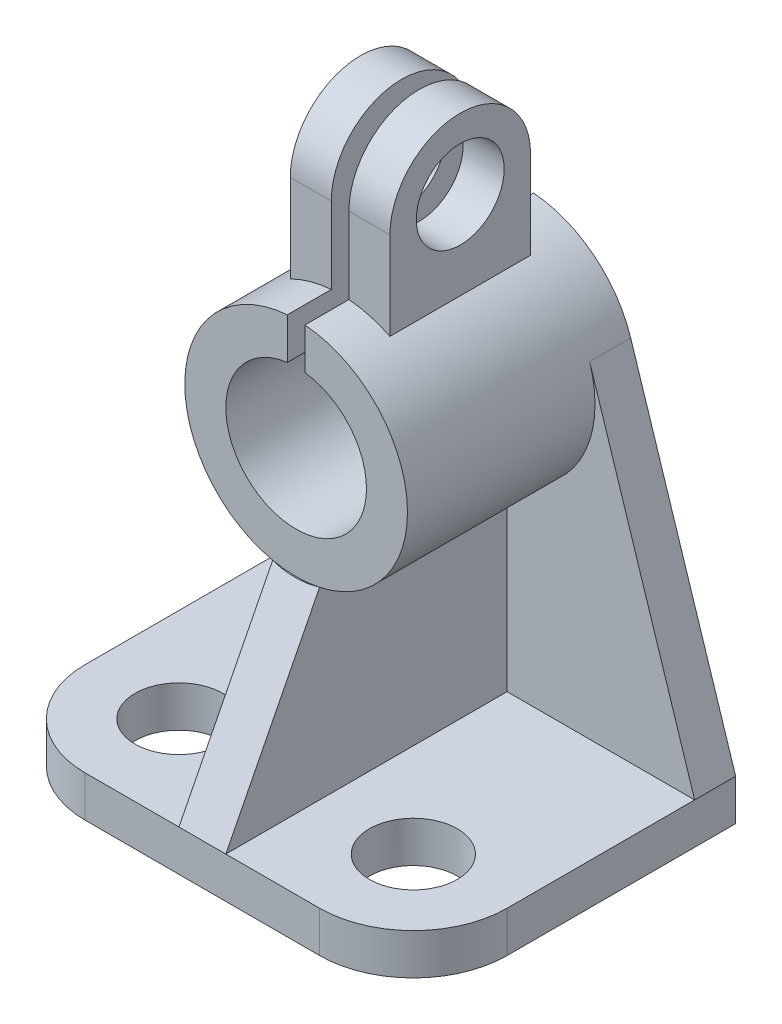
ISO-10303-21;
HEADER;
FILE_DESCRIPTION(('STEP AP214'),'2;1');
FILE_NAME('part.step','',(''),(''),'','','');
FILE_SCHEMA(('AUTOMOTIVE_DESIGN { 1 0 10303 214 1 1 1 1 }'));
ENDSEC;
DATA;
#1=APPLICATION_CONTEXT('core data for automotive mechanical design processes');
#2=APPLICATION_PROTOCOL_DEFINITION('international standard','automotive_design',2000,#1);
#3=PRODUCT_CONTEXT('',#1,'mechanical');
#4=PRODUCT('Part','Part','',(#3));
#5=PRODUCT_RELATED_PRODUCT_CATEGORY('part','',(#4));
#6=PRODUCT_DEFINITION_FORMATION('','',#4);
#7=PRODUCT_DEFINITION_CONTEXT('part definition',#1,'design');
#8=PRODUCT_DEFINITION('design','',#6,#7);
#9=PRODUCT_DEFINITION_SHAPE('','',#8);
#10=(LENGTH_UNIT() NAMED_UNIT(*) SI_UNIT(.MILLI.,.METRE.));
#11=(NAMED_UNIT(*) PLANE_ANGLE_UNIT() SI_UNIT($,.RADIAN.));
#12=(NAMED_UNIT(*) SI_UNIT($,.STERADIAN.) SOLID_ANGLE_UNIT());
#13=UNCERTAINTY_MEASURE_WITH_UNIT(LENGTH_MEASURE(1.E-05),#10,'distance_accuracy_value','');
#14=(GEOMETRIC_REPRESENTATION_CONTEXT(3) GLOBAL_UNCERTAINTY_ASSIGNED_CONTEXT((#13)) GLOBAL_UNIT_ASSIGNED_CONTEXT((#10,
#11,#12)) REPRESENTATION_CONTEXT('',''));
#15=CARTESIAN_POINT('',(0.,0.,0.));
#16=DIRECTION('',(0.,0.,1.));
#17=DIRECTION('',(1.,0.,0.));
#18=AXIS2_PLACEMENT_3D('',#15,#16,#17);
#19=CARTESIAN_POINT('',(8.49999999999999,0.,31.5));
#20=DIRECTION('',(-1.,0.,0.));
#21=DIRECTION('',(0.,-1.,0.));
#22=AXIS2_PLACEMENT_3D('',#19,#20,#21);
#23=PLANE('',#22);
#24=DIRECTION('',(0.,1.,0.));
#25=VECTOR('',#24,1.);
#26=CARTESIAN_POINT('',(8.49999999999999,0.,7.5));
#27=LINE('',#26,#25);
#28=CARTESIAN_POINT('',(8.5,73.9926454679664,7.5));
#29=VERTEX_POINT('',#28);
#30=CARTESIAN_POINT('',(8.5,88.9999999999999,7.5));
#31=VERTEX_POINT('',#30);
#32=EDGE_CURVE('E309',#29,#31,#27,.T.);
#33=ORIENTED_EDGE('',*,*,#32,.T.);
#34=CARTESIAN_POINT('',(8.5,88.9999999999999,19.5));
#35=DIRECTION('',(-1.,0.,0.));
#36=DIRECTION('',(0.,-1.,0.));
#37=AXIS2_PLACEMENT_3D('',#34,#35,#36);
#38=CIRCLE('',#37,12.);
#39=CARTESIAN_POINT('',(8.5,88.9999999999999,31.5));
#40=VERTEX_POINT('',#39);
#41=EDGE_CURVE('E452',#31,#40,#38,.F.);
#42=ORIENTED_EDGE('',*,*,#41,.T.);
#43=DIRECTION('',(0.,1.,0.));
#44=VECTOR('',#43,1.);
#45=CARTESIAN_POINT('',(8.49999999999999,0.,31.5));
#46=LINE('',#45,#44);
#47=CARTESIAN_POINT('',(8.5,73.9926454679664,31.5));
#48=VERTEX_POINT('',#47);
#49=EDGE_CURVE('E296',#48,#40,#46,.T.);
#50=ORIENTED_EDGE('',*,*,#49,.F.);
#51=DIRECTION('',(0.,0.,-1.));
#52=VECTOR('',#51,1.);
#53=CARTESIAN_POINT('',(8.5,73.9926454679664,31.5));
#54=LINE('',#53,#52);
#55=EDGE_CURVE('E305',#48,#29,#54,.T.);
#56=ORIENTED_EDGE('',*,*,#55,.T.);
#57=EDGE_LOOP('',(#33,#42,#50,#56));
#58=FACE_BOUND('',#57,.T.);
#59=CARTESIAN_POINT('',(8.5,88.9999999999999,19.5));
#60=DIRECTION('',(1.,0.,0.));
#61=DIRECTION('',(0.,0.,-1.));
#62=AXIS2_PLACEMENT_3D('',#59,#60,#61);
#63=CIRCLE('',#62,7.49999999999999);
#64=CARTESIAN_POINT('',(8.5,88.9999999999999,12.));
#65=VERTEX_POINT('',#64);
#66=EDGE_CURVE('E480',#65,#65,#63,.T.);
#67=ORIENTED_EDGE('',*,*,#66,.F.);
#68=EDGE_LOOP('',(#67));
#69=FACE_BOUND('',#68,.T.);
#70=ADVANCED_FACE('F45',(#58,#69),#23,.F.);
#71=CARTESIAN_POINT('',(-1.5,88.9999999999999,19.5));
#72=DIRECTION('',(-1.,0.,0.));
#73=DIRECTION('',(0.,0.,1.));
#74=AXIS2_PLACEMENT_3D('',#71,#72,#73);
#75=CYLINDRICAL_SURFACE('',#74,12.);
#76=DIRECTION('',(1.,0.,0.));
#77=VECTOR('',#76,1.);
#78=CARTESIAN_POINT('',(-1.5,88.9999999999999,31.5));
#79=LINE('',#78,#77);
#80=CARTESIAN_POINT('',(-1.5,88.9999999999999,31.5));
#81=VERTEX_POINT('',#80);
#82=CARTESIAN_POINT('',(-8.5,88.9999999999999,31.5));
#83=VERTEX_POINT('',#82);
#84=EDGE_CURVE('E458',#81,#83,#79,.F.);
#85=ORIENTED_EDGE('',*,*,#84,.F.);
#86=CARTESIAN_POINT('',(-1.5,88.9999999999999,19.5));
#87=DIRECTION('',(-1.,0.,0.));
#88=DIRECTION('',(0.,0.,1.));
#89=AXIS2_PLACEMENT_3D('',#86,#87,#88);
#90=CIRCLE('',#89,12.);
#91=CARTESIAN_POINT('',(-1.5,88.9999999999999,7.5));
#92=VERTEX_POINT('',#91);
#93=EDGE_CURVE('E466',#92,#81,#90,.F.);
#94=ORIENTED_EDGE('',*,*,#93,.F.);
#95=DIRECTION('',(-1.,0.,0.));
#96=VECTOR('',#95,1.);
#97=CARTESIAN_POINT('',(0.,88.9999999999999,7.5));
#98=LINE('',#97,#96);
#99=CARTESIAN_POINT('',(-8.5,88.9999999999999,7.5));
#100=VERTEX_POINT('',#99);
#101=EDGE_CURVE('E462',#100,#92,#98,.F.);
#102=ORIENTED_EDGE('',*,*,#101,.F.);
#103=CARTESIAN_POINT('',(-8.5,88.9999999999999,19.5));
#104=DIRECTION('',(-1.,0.,0.));
#105=DIRECTION('',(0.,-1.,0.));
#106=AXIS2_PLACEMENT_3D('',#103,#104,#105);
#107=CIRCLE('',#106,12.);
#108=EDGE_CURVE('E469',#83,#100,#107,.T.);
#109=ORIENTED_EDGE('',*,*,#108,.F.);
#110=EDGE_LOOP('',(#85,#94,#102,#109));
#111=FACE_BOUND('',#110,.T.);
#112=ADVANCED_FACE('F545',(#111),#75,.T.);
#113=CARTESIAN_POINT('',(8.5,88.9999999999999,19.5));
#114=DIRECTION('',(1.,0.,0.));
#115=DIRECTION('',(0.,0.,-1.));
#116=AXIS2_PLACEMENT_3D('',#113,#114,#115);
#117=CYLINDRICAL_SURFACE('',#116,12.);
#118=DIRECTION('',(1.,0.,0.));
#119=VECTOR('',#118,1.);
#120=CARTESIAN_POINT('',(0.,88.9999999999999,31.5));
#121=LINE('',#120,#119);
#122=CARTESIAN_POINT('',(1.5,88.9999999999999,31.5));
#123=VERTEX_POINT('',#122);
#124=EDGE_CURVE('E444',#40,#123,#121,.F.);
#125=ORIENTED_EDGE('',*,*,#124,.F.);
#126=ORIENTED_EDGE('',*,*,#41,.F.);
#127=DIRECTION('',(-1.,0.,0.));
#128=VECTOR('',#127,1.);
#129=CARTESIAN_POINT('',(8.5,88.9999999999999,7.5));
#130=LINE('',#129,#128);
#131=CARTESIAN_POINT('',(1.5,88.9999999999999,7.5));
#132=VERTEX_POINT('',#131);
#133=EDGE_CURVE('E448',#132,#31,#130,.F.);
#134=ORIENTED_EDGE('',*,*,#133,.F.);
#135=CARTESIAN_POINT('',(1.5,88.9999999999999,19.5));
#136=DIRECTION('',(-1.,0.,0.));
#137=DIRECTION('',(0.,0.,1.));
#138=AXIS2_PLACEMENT_3D('',#135,#136,#137);
#139=CIRCLE('',#138,12.);
#140=EDGE_CURVE('E455',#123,#132,#139,.T.);
#141=ORIENTED_EDGE('',*,*,#140,.F.);
#142=EDGE_LOOP('',(#125,#126,#134,#141));
#143=FACE_BOUND('',#142,.T.);
#144=ADVANCED_FACE('F551',(#143),#117,.T.);
#145=CARTESIAN_POINT('',(0.,6.99999999999999,55.));
#146=DIRECTION('',(0.,-1.,0.));
#147=DIRECTION('',(0.,0.,-1.));
#148=AXIS2_PLACEMENT_3D('',#145,#146,#147);
#149=PLANE('',#148);
#150=CARTESIAN_POINT('',(20.,6.99999999999999,39.));
#151=DIRECTION('',(0.,1.,0.));
#152=DIRECTION('',(0.,0.,1.));
#153=AXIS2_PLACEMENT_3D('',#150,#151,#152);
#154=CIRCLE('',#153,7.49999999999999);
#155=CARTESIAN_POINT('',(20.,6.99999999999999,46.5));
#156=VERTEX_POINT('',#155);
#157=EDGE_CURVE('E516',#156,#156,#154,.T.);
#158=ORIENTED_EDGE('',*,*,#157,.F.);
#159=EDGE_LOOP('',(#158));
#160=FACE_BOUND('',#159,.T.);
#161=DIRECTION('',(-1.,0.,0.));
#162=VECTOR('',#161,1.);
#163=CARTESIAN_POINT('',(0.,6.99999999999999,55.));
#164=LINE('',#163,#162);
#165=CARTESIAN_POINT('',(20.,6.99999999999999,55.));
#166=VERTEX_POINT('',#165);
#167=CARTESIAN_POINT('',(4.,6.99999999999999,55.));
#168=VERTEX_POINT('',#167);
#169=EDGE_CURVE('E214',#166,#168,#164,.T.);
#170=ORIENTED_EDGE('',*,*,#169,.F.);
#171=CARTESIAN_POINT('',(20.,6.99999999999999,39.));
#172=DIRECTION('',(0.,-1.,0.));
#173=DIRECTION('',(0.,0.,-1.));
#174=AXIS2_PLACEMENT_3D('',#171,#172,#173);
#175=CIRCLE('',#174,16.);
#176=CARTESIAN_POINT('',(36.,6.99999999999999,39.));
#177=VERTEX_POINT('',#176);
#178=EDGE_CURVE('E11',#166,#177,#175,.F.);
#179=ORIENTED_EDGE('',*,*,#178,.T.);
#180=DIRECTION('',(0.,0.,-1.));
#181=VECTOR('',#180,1.);
#182=CARTESIAN_POINT('',(36.,6.99999999999999,55.));
#183=LINE('',#182,#181);
#184=CARTESIAN_POINT('',(36.,6.99999999999999,7.));
#185=VERTEX_POINT('',#184);
#186=EDGE_CURVE('E421',#177,#185,#183,.T.);
#187=ORIENTED_EDGE('',*,*,#186,.T.);
#188=DIRECTION('',(-1.,0.,0.));
#189=VECTOR('',#188,1.);
#190=CARTESIAN_POINT('',(0.,6.99999999999999,7.));
#191=LINE('',#190,#189);
#192=CARTESIAN_POINT('',(4.,6.99999999999999,7.));
#193=VERTEX_POINT('',#192);
#194=EDGE_CURVE('E251',#185,#193,#191,.T.);
#195=ORIENTED_EDGE('',*,*,#194,.T.);
#196=DIRECTION('',(0.,0.,-1.));
#197=VECTOR('',#196,1.);
#198=CARTESIAN_POINT('',(4.,6.99999999999999,55.));
#199=LINE('',#198,#197);
#200=EDGE_CURVE('E240',#168,#193,#199,.T.);
#201=ORIENTED_EDGE('',*,*,#200,.F.);
#202=EDGE_LOOP('',(#170,#179,#187,#195,#201));
#203=FACE_BOUND('',#202,.T.);
#204=ADVANCED_FACE('F249',(#160,#203),#149,.F.);
#205=CARTESIAN_POINT('',(0.,57.,39.));
#206=DIRECTION('',(0.,0.,-1.));
#207=DIRECTION('',(-1.,0.,0.));
#208=AXIS2_PLACEMENT_3D('',#205,#206,#207);
#209=CYLINDRICAL_SURFACE('',#208,19.);
#210=DIRECTION('',(0.,0.,-1.));
#211=VECTOR('',#210,1.);
#212=CARTESIAN_POINT('',(4.,38.4258243789932,55.));
#213=LINE('',#212,#211);
#214=CARTESIAN_POINT('',(4.,38.4258243789932,39.));
#215=VERTEX_POINT('',#214);
#216=CARTESIAN_POINT('',(4.,38.4258243789932,7.));
#217=VERTEX_POINT('',#216);
#218=EDGE_CURVE('E243',#215,#217,#213,.T.);
#219=ORIENTED_EDGE('',*,*,#218,.T.);
#220=CARTESIAN_POINT('',(0.,57.,7.));
#221=DIRECTION('',(0.,0.,1.));
#222=DIRECTION('',(1.,0.,0.));
#223=AXIS2_PLACEMENT_3D('',#220,#221,#222);
#224=CIRCLE('',#223,19.);
#225=CARTESIAN_POINT('',(18.0912616954563,62.8057084207285,7.));
#226=VERTEX_POINT('',#225);
#227=EDGE_CURVE('E395',#217,#226,#224,.T.);
#228=ORIENTED_EDGE('',*,*,#227,.T.);
#229=DIRECTION('',(0.,0.,-1.));
#230=VECTOR('',#229,1.);
#231=CARTESIAN_POINT('',(18.0912616954562,62.8057084207285,7.));
#232=LINE('',#231,#230);
#233=CARTESIAN_POINT('',(18.0912616954562,62.8057084207285,0.));
#234=VERTEX_POINT('',#233);
#235=EDGE_CURVE('E408',#226,#234,#232,.T.);
#236=ORIENTED_EDGE('',*,*,#235,.T.);
#237=CARTESIAN_POINT('',(0.,57.,0.));
#238=DIRECTION('',(0.,0.,1.));
#239=DIRECTION('',(1.,0.,0.));
#240=AXIS2_PLACEMENT_3D('',#237,#238,#239);
#241=CIRCLE('',#240,19.);
#242=CARTESIAN_POINT('',(1.5,75.9406969248758,0.));
#243=VERTEX_POINT('',#242);
#244=EDGE_CURVE('E345',#234,#243,#241,.T.);
#245=ORIENTED_EDGE('',*,*,#244,.T.);
#246=DIRECTION('',(0.,0.,-1.));
#247=VECTOR('',#246,1.);
#248=CARTESIAN_POINT('',(1.5,75.9406969248758,39.));
#249=LINE('',#248,#247);
#250=CARTESIAN_POINT('',(1.5,75.9406969248758,7.5));
#251=VERTEX_POINT('',#250);
#252=EDGE_CURVE('E355',#251,#243,#249,.T.);
#253=ORIENTED_EDGE('',*,*,#252,.F.);
#254=CARTESIAN_POINT('',(0.,57.,7.5));
#255=DIRECTION('',(0.,0.,1.));
#256=DIRECTION('',(1.,0.,0.));
#257=AXIS2_PLACEMENT_3D('',#254,#255,#256);
#258=CIRCLE('',#257,19.);
#259=EDGE_CURVE('E291',#29,#251,#258,.T.);
#260=ORIENTED_EDGE('',*,*,#259,.F.);
#261=ORIENTED_EDGE('',*,*,#55,.F.);
#262=CARTESIAN_POINT('',(0.,57.,31.5));
#263=DIRECTION('',(0.,0.,1.));
#264=DIRECTION('',(1.,0.,0.));
#265=AXIS2_PLACEMENT_3D('',#262,#263,#264);
#266=CIRCLE('',#265,19.);
#267=CARTESIAN_POINT('',(1.5,75.9406969248758,31.5));
#268=VERTEX_POINT('',#267);
#269=EDGE_CURVE('E292',#48,#268,#266,.T.);
#270=ORIENTED_EDGE('',*,*,#269,.T.);
#271=CARTESIAN_POINT('',(1.5,75.9406969248758,39.));
#272=VERTEX_POINT('',#271);
#273=EDGE_CURVE('E356',#272,#268,#249,.T.);
#274=ORIENTED_EDGE('',*,*,#273,.F.);
#275=CARTESIAN_POINT('',(0.,57.,39.));
#276=DIRECTION('',(0.,0.,1.));
#277=DIRECTION('',(1.,0.,0.));
#278=AXIS2_PLACEMENT_3D('',#275,#276,#277);
#279=CIRCLE('',#278,19.);
#280=EDGE_CURVE('E327',#215,#272,#279,.T.);
#281=ORIENTED_EDGE('',*,*,#280,.F.);
#282=EDGE_LOOP('',(#219,#228,#236,#245,#253,#260,#261,#270,#274,#281));
#283=FACE_BOUND('',#282,.T.);
#284=ADVANCED_FACE('F574',(#283),#209,.T.);
#285=CARTESIAN_POINT('',(-20.,6.99999999999999,39.));
#286=DIRECTION('',(0.,1.,0.));
#287=DIRECTION('',(0.,0.,1.));
#288=AXIS2_PLACEMENT_3D('',#285,#286,#287);
#289=CIRCLE('',#288,7.49999999999999);
#290=CARTESIAN_POINT('',(-20.,6.99999999999999,46.5));
#291=VERTEX_POINT('',#290);
#292=EDGE_CURVE('E503',#291,#291,#289,.T.);
#293=ORIENTED_EDGE('',*,*,#292,.F.);
#294=EDGE_LOOP('',(#293));
#295=FACE_BOUND('',#294,.T.);
#296=DIRECTION('',(0.,0.,-1.));
#297=VECTOR('',#296,1.);
#298=CARTESIAN_POINT('',(-36.,6.99999999999999,55.));
#299=LINE('',#298,#297);
#300=CARTESIAN_POINT('',(-36.,6.99999999999999,39.));
#301=VERTEX_POINT('',#300);
#302=CARTESIAN_POINT('',(-36.,6.99999999999999,7.));
#303=VERTEX_POINT('',#302);
#304=EDGE_CURVE('E441',#301,#303,#299,.T.);
#305=ORIENTED_EDGE('',*,*,#304,.F.);
#306=CARTESIAN_POINT('',(-20.,6.99999999999999,39.));
#307=DIRECTION('',(0.,-1.,0.));
#308=DIRECTION('',(0.,0.,-1.));
#309=AXIS2_PLACEMENT_3D('',#306,#307,#308);
#310=CIRCLE('',#309,16.);
#311=CARTESIAN_POINT('',(-20.,6.99999999999999,55.));
#312=VERTEX_POINT('',#311);
#313=EDGE_CURVE('E495',#301,#312,#310,.F.);
#314=ORIENTED_EDGE('',*,*,#313,.T.);
#315=CARTESIAN_POINT('',(-4.,6.99999999999999,55.));
#316=VERTEX_POINT('',#315);
#317=EDGE_CURVE('E226',#316,#312,#164,.T.);
#318=ORIENTED_EDGE('',*,*,#317,.F.);
#319=DIRECTION('',(0.,0.,-1.));
#320=VECTOR('',#319,1.);
#321=CARTESIAN_POINT('',(-4.,6.99999999999999,55.));
#322=LINE('',#321,#320);
#323=CARTESIAN_POINT('',(-4.,6.99999999999999,7.));
#324=VERTEX_POINT('',#323);
#325=EDGE_CURVE('E253',#316,#324,#322,.T.);
#326=ORIENTED_EDGE('',*,*,#325,.T.);
#327=DIRECTION('',(-1.,0.,0.));
#328=VECTOR('',#327,1.);
#329=CARTESIAN_POINT('',(0.,6.99999999999999,7.));
#330=LINE('',#329,#328);
#331=EDGE_CURVE('E376',#324,#303,#330,.T.);
#332=ORIENTED_EDGE('',*,*,#331,.T.);
#333=EDGE_LOOP('',(#305,#314,#318,#326,#332));
#334=FACE_BOUND('',#333,.T.);
#335=ADVANCED_FACE('F612',(#295,#334),#149,.F.);
#336=CARTESIAN_POINT('',(-36.,0.,55.));
#337=DIRECTION('',(1.,0.,0.));
#338=DIRECTION('',(0.,0.,-1.));
#339=AXIS2_PLACEMENT_3D('',#336,#337,#338);
#340=PLANE('',#339);
#341=DIRECTION('',(0.,0.,-1.));
#342=VECTOR('',#341,1.);
#343=CARTESIAN_POINT('',(-36.,0.,55.));
#344=LINE('',#343,#342);
#345=CARTESIAN_POINT('',(-36.,0.,39.));
#346=VERTEX_POINT('',#345);
#347=CARTESIAN_POINT('',(-36.,0.,0.));
#348=VERTEX_POINT('',#347);
#349=EDGE_CURVE('E438',#346,#348,#344,.T.);
#350=ORIENTED_EDGE('',*,*,#349,.F.);
#351=DIRECTION('',(0.,-1.,0.));
#352=VECTOR('',#351,1.);
#353=CARTESIAN_POINT('',(-36.,6.99999999999999,39.));
#354=LINE('',#353,#352);
#355=EDGE_CURVE('E69',#346,#301,#354,.F.);
#356=ORIENTED_EDGE('',*,*,#355,.T.);
#357=ORIENTED_EDGE('',*,*,#304,.T.);
#358=DIRECTION('',(0.,0.,-1.));
#359=VECTOR('',#358,1.);
#360=CARTESIAN_POINT('',(-36.,6.99999999999999,7.));
#361=LINE('',#360,#359);
#362=CARTESIAN_POINT('',(-36.,6.99999999999999,0.));
#363=VERTEX_POINT('',#362);
#364=EDGE_CURVE('E384',#303,#363,#361,.T.);
#365=ORIENTED_EDGE('',*,*,#364,.T.);
#366=DIRECTION('',(0.,-1.,0.));
#367=VECTOR('',#366,1.);
#368=CARTESIAN_POINT('',(-36.,0.,0.));
#369=LINE('',#368,#367);
#370=EDGE_CURVE('E416',#363,#348,#369,.T.);
#371=ORIENTED_EDGE('',*,*,#370,.T.);
#372=EDGE_LOOP('',(#350,#356,#357,#365,#371));
#373=FACE_BOUND('',#372,.T.);
#374=ADVANCED_FACE('F608',(#373),#340,.F.);
#375=CARTESIAN_POINT('',(0.,0.,55.));
#376=DIRECTION('',(0.,-1.,0.));
#377=DIRECTION('',(0.,0.,-1.));
#378=AXIS2_PLACEMENT_3D('',#375,#376,#377);
#379=PLANE('',#378);
#380=CARTESIAN_POINT('',(20.,0.,39.));
#381=DIRECTION('',(0.,-1.,0.));
#382=DIRECTION('',(0.,0.,-1.));
#383=AXIS2_PLACEMENT_3D('',#380,#381,#382);
#384=CIRCLE('',#383,7.49999999999999);
#385=CARTESIAN_POINT('',(20.,0.,31.5));
#386=VERTEX_POINT('',#385);
#387=EDGE_CURVE('E49',#386,#386,#384,.T.);
#388=ORIENTED_EDGE('',*,*,#387,.F.);
#389=EDGE_LOOP('',(#388));
#390=FACE_BOUND('',#389,.T.);
#391=CARTESIAN_POINT('',(-20.,0.,39.));
#392=DIRECTION('',(0.,-1.,0.));
#393=DIRECTION('',(0.,0.,-1.));
#394=AXIS2_PLACEMENT_3D('',#391,#392,#393);
#395=CIRCLE('',#394,7.49999999999999);
#396=CARTESIAN_POINT('',(-20.,0.,31.5));
#397=VERTEX_POINT('',#396);
#398=EDGE_CURVE('E500',#397,#397,#395,.T.);
#399=ORIENTED_EDGE('',*,*,#398,.F.);
#400=EDGE_LOOP('',(#399));
#401=FACE_BOUND('',#400,.T.);
#402=DIRECTION('',(-1.,0.,0.));
#403=VECTOR('',#402,1.);
#404=CARTESIAN_POINT('',(0.,0.,55.));
#405=LINE('',#404,#403);
#406=CARTESIAN_POINT('',(20.,0.,55.));
#407=VERTEX_POINT('',#406);
#408=CARTESIAN_POINT('',(-20.,0.,55.));
#409=VERTEX_POINT('',#408);
#410=EDGE_CURVE('E225',#407,#409,#405,.T.);
#411=ORIENTED_EDGE('',*,*,#410,.T.);
#412=CARTESIAN_POINT('',(-20.,0.,39.));
#413=DIRECTION('',(0.,-1.,0.));
#414=DIRECTION('',(0.,0.,-1.));
#415=AXIS2_PLACEMENT_3D('',#412,#413,#414);
#416=CIRCLE('',#415,16.);
#417=EDGE_CURVE('E490',#409,#346,#416,.T.);
#418=ORIENTED_EDGE('',*,*,#417,.T.);
#419=ORIENTED_EDGE('',*,*,#349,.T.);
#420=DIRECTION('',(-1.,0.,0.));
#421=VECTOR('',#420,1.);
#422=CARTESIAN_POINT('',(0.,0.,0.));
#423=LINE('',#422,#421);
#424=CARTESIAN_POINT('',(36.,0.,0.));
#425=VERTEX_POINT('',#424);
#426=EDGE_CURVE('E425',#425,#348,#423,.T.);
#427=ORIENTED_EDGE('',*,*,#426,.F.);
#428=DIRECTION('',(0.,0.,-1.));
#429=VECTOR('',#428,1.);
#430=CARTESIAN_POINT('',(36.,0.,55.));
#431=LINE('',#430,#429);
#432=CARTESIAN_POINT('',(36.,0.,39.));
#433=VERTEX_POINT('',#432);
#434=EDGE_CURVE('E435',#433,#425,#431,.T.);
#435=ORIENTED_EDGE('',*,*,#434,.F.);
#436=CARTESIAN_POINT('',(20.,0.,39.));
#437=DIRECTION('',(0.,-1.,0.));
#438=DIRECTION('',(0.,0.,-1.));
#439=AXIS2_PLACEMENT_3D('',#436,#437,#438);
#440=CIRCLE('',#439,16.);
#441=EDGE_CURVE('E487',#433,#407,#440,.T.);
#442=ORIENTED_EDGE('',*,*,#441,.T.);
#443=EDGE_LOOP('',(#411,#418,#419,#427,#435,#442));
#444=FACE_BOUND('',#443,.T.);
#445=ADVANCED_FACE('F604',(#390,#401,#444),#379,.T.);
#446=CARTESIAN_POINT('',(36.,0.,55.));
#447=DIRECTION('',(1.,0.,0.));
#448=DIRECTION('',(0.,0.,-1.));
#449=AXIS2_PLACEMENT_3D('',#446,#447,#448);
#450=PLANE('',#449);
#451=ORIENTED_EDGE('',*,*,#186,.F.);
#452=DIRECTION('',(0.,-1.,0.));
#453=VECTOR('',#452,1.);
#454=CARTESIAN_POINT('',(36.,0.,39.));
#455=LINE('',#454,#453);
#456=EDGE_CURVE('E55',#177,#433,#455,.T.);
#457=ORIENTED_EDGE('',*,*,#456,.T.);
#458=ORIENTED_EDGE('',*,*,#434,.T.);
#459=DIRECTION('',(0.,-1.,0.));
#460=VECTOR('',#459,1.);
#461=CARTESIAN_POINT('',(36.,0.,0.));
#462=LINE('',#461,#460);
#463=CARTESIAN_POINT('',(36.,6.99999999999999,0.));
#464=VERTEX_POINT('',#463);
#465=EDGE_CURVE('E429',#464,#425,#462,.T.);
#466=ORIENTED_EDGE('',*,*,#465,.F.);
#467=DIRECTION('',(0.,0.,-1.));
#468=VECTOR('',#467,1.);
#469=CARTESIAN_POINT('',(36.,6.99999999999999,7.));
#470=LINE('',#469,#468);
#471=EDGE_CURVE('E414',#185,#464,#470,.T.);
#472=ORIENTED_EDGE('',*,*,#471,.F.);
#473=EDGE_LOOP('',(#451,#457,#458,#466,#472));
#474=FACE_BOUND('',#473,.T.);
#475=ADVANCED_FACE('F598',(#474),#450,.T.);
#476=CARTESIAN_POINT('',(0.,0.,55.));
#477=DIRECTION('',(0.,0.,1.));
#478=DIRECTION('',(1.,0.,0.));
#479=AXIS2_PLACEMENT_3D('',#476,#477,#478);
#480=PLANE('',#479);
#481=ORIENTED_EDGE('',*,*,#317,.T.);
#482=DIRECTION('',(0.,-1.,0.));
#483=VECTOR('',#482,1.);
#484=CARTESIAN_POINT('',(-20.,0.,55.));
#485=LINE('',#484,#483);
#486=EDGE_CURVE('E483',#312,#409,#485,.T.);
#487=ORIENTED_EDGE('',*,*,#486,.T.);
#488=ORIENTED_EDGE('',*,*,#410,.F.);
#489=DIRECTION('',(0.,-1.,0.));
#490=VECTOR('',#489,1.);
#491=CARTESIAN_POINT('',(20.,0.,55.));
#492=LINE('',#491,#490);
#493=EDGE_CURVE('E222',#407,#166,#492,.F.);
#494=ORIENTED_EDGE('',*,*,#493,.T.);
#495=ORIENTED_EDGE('',*,*,#169,.T.);
#496=DIRECTION('',(1.,0.,0.));
#497=VECTOR('',#496,1.);
#498=CARTESIAN_POINT('',(-51.,6.99999999999999,55.));
#499=LINE('',#498,#497);
#500=EDGE_CURVE('E218',#316,#168,#499,.T.);
#501=ORIENTED_EDGE('',*,*,#500,.F.);
#502=EDGE_LOOP('',(#481,#487,#488,#494,#495,#501));
#503=FACE_BOUND('',#502,.T.);
#504=ADVANCED_FACE('F217',(#503),#480,.T.);
#505=CARTESIAN_POINT('',(0.,0.,0.));
#506=DIRECTION('',(0.,0.,1.));
#507=DIRECTION('',(1.,0.,0.));
#508=AXIS2_PLACEMENT_3D('',#505,#506,#507);
#509=PLANE('',#508);
#510=ORIENTED_EDGE('',*,*,#244,.F.);
#511=DIRECTION('',(-0.305563601090973,0.952171668181907,0.));
#512=VECTOR('',#511,1.);
#513=CARTESIAN_POINT('',(34.6753549112846,11.1277479364945,0.));
#514=LINE('',#513,#512);
#515=EDGE_CURVE('E394',#464,#234,#514,.T.);
#516=ORIENTED_EDGE('',*,*,#515,.F.);
#517=ORIENTED_EDGE('',*,*,#465,.T.);
#518=ORIENTED_EDGE('',*,*,#426,.T.);
#519=ORIENTED_EDGE('',*,*,#370,.F.);
#520=DIRECTION('',(0.305563601090973,0.952171668181907,0.));
#521=VECTOR('',#520,1.);
#522=CARTESIAN_POINT('',(-34.6753549112846,11.1277479364945,0.));
#523=LINE('',#522,#521);
#524=CARTESIAN_POINT('',(-18.0912616954562,62.8057084207285,0.));
#525=VERTEX_POINT('',#524);
#526=EDGE_CURVE('E367',#363,#525,#523,.T.);
#527=ORIENTED_EDGE('',*,*,#526,.T.);
#528=CARTESIAN_POINT('',(-1.5,75.9406969248758,0.));
#529=VERTEX_POINT('',#528);
#530=EDGE_CURVE('E346',#529,#525,#241,.T.);
#531=ORIENTED_EDGE('',*,*,#530,.F.);
#532=DIRECTION('',(0.,1.,0.));
#533=VECTOR('',#532,1.);
#534=CARTESIAN_POINT('',(-1.5,0.,0.));
#535=LINE('',#534,#533);
#536=CARTESIAN_POINT('',(-1.5,68.9058808997906,0.));
#537=VERTEX_POINT('',#536);
#538=EDGE_CURVE('E341',#537,#529,#535,.T.);
#539=ORIENTED_EDGE('',*,*,#538,.F.);
#540=CARTESIAN_POINT('',(0.,57.,0.));
#541=DIRECTION('',(0.,0.,1.));
#542=DIRECTION('',(1.,0.,0.));
#543=AXIS2_PLACEMENT_3D('',#540,#541,#542);
#544=CIRCLE('',#543,12.);
#545=CARTESIAN_POINT('',(1.5,68.9058808997906,0.));
#546=VERTEX_POINT('',#545);
#547=EDGE_CURVE('E318',#537,#546,#544,.T.);
#548=ORIENTED_EDGE('',*,*,#547,.T.);
#549=DIRECTION('',(0.,1.,0.));
#550=VECTOR('',#549,1.);
#551=CARTESIAN_POINT('',(1.5,0.,0.));
#552=LINE('',#551,#550);
#553=EDGE_CURVE('E324',#546,#243,#552,.T.);
#554=ORIENTED_EDGE('',*,*,#553,.T.);
#555=EDGE_LOOP('',(#510,#516,#517,#518,#519,#527,#531,#539,#548,#554));
#556=FACE_BOUND('',#555,.T.);
#557=ADVANCED_FACE('F594',(#556),#509,.F.);
#558=CARTESIAN_POINT('',(34.6753549112846,11.1277479364945,7.));
#559=DIRECTION('',(-0.952171668181907,-0.305563601090973,0.));
#560=DIRECTION('',(0.305563601090973,-0.952171668181908,0.));
#561=AXIS2_PLACEMENT_3D('',#558,#559,#560);
#562=PLANE('',#561);
#563=ORIENTED_EDGE('',*,*,#515,.T.);
#564=ORIENTED_EDGE('',*,*,#235,.F.);
#565=DIRECTION('',(-0.305563601090973,0.952171668181907,0.));
#566=VECTOR('',#565,1.);
#567=CARTESIAN_POINT('',(34.6753549112846,11.1277479364945,7.));
#568=LINE('',#567,#566);
#569=EDGE_CURVE('E404',#185,#226,#568,.T.);
#570=ORIENTED_EDGE('',*,*,#569,.F.);
#571=ORIENTED_EDGE('',*,*,#471,.T.);
#572=EDGE_LOOP('',(#563,#564,#570,#571));
#573=FACE_BOUND('',#572,.T.);
#574=ADVANCED_FACE('F590',(#573),#562,.F.);
#575=CARTESIAN_POINT('',(0.,0.,7.));
#576=DIRECTION('',(0.,0.,1.));
#577=DIRECTION('',(1.,0.,0.));
#578=AXIS2_PLACEMENT_3D('',#575,#576,#577);
#579=PLANE('',#578);
#580=ORIENTED_EDGE('',*,*,#227,.F.);
#581=DIRECTION('',(0.,1.,0.));
#582=VECTOR('',#581,1.);
#583=CARTESIAN_POINT('',(4.,0.,7.));
#584=LINE('',#583,#582);
#585=EDGE_CURVE('E399',#193,#217,#584,.T.);
#586=ORIENTED_EDGE('',*,*,#585,.F.);
#587=ORIENTED_EDGE('',*,*,#194,.F.);
#588=ORIENTED_EDGE('',*,*,#569,.T.);
#589=EDGE_LOOP('',(#580,#586,#587,#588));
#590=FACE_BOUND('',#589,.T.);
#591=ADVANCED_FACE('F586',(#590),#579,.T.);
#592=CARTESIAN_POINT('',(-34.6753549112846,11.1277479364945,7.));
#593=DIRECTION('',(-0.952171668181907,0.305563601090973,0.));
#594=DIRECTION('',(-0.305563601090973,-0.952171668181908,0.));
#595=AXIS2_PLACEMENT_3D('',#592,#593,#594);
#596=PLANE('',#595);
#597=ORIENTED_EDGE('',*,*,#526,.F.);
#598=ORIENTED_EDGE('',*,*,#364,.F.);
#599=DIRECTION('',(0.305563601090973,0.952171668181907,0.));
#600=VECTOR('',#599,1.);
#601=CARTESIAN_POINT('',(-34.6753549112846,11.1277479364945,7.));
#602=LINE('',#601,#600);
#603=CARTESIAN_POINT('',(-18.0912616954562,62.8057084207285,7.));
#604=VERTEX_POINT('',#603);
#605=EDGE_CURVE('E372',#303,#604,#602,.T.);
#606=ORIENTED_EDGE('',*,*,#605,.T.);
#607=DIRECTION('',(0.,0.,-1.));
#608=VECTOR('',#607,1.);
#609=CARTESIAN_POINT('',(-18.0912616954562,62.8057084207285,7.));
#610=LINE('',#609,#608);
#611=EDGE_CURVE('E391',#604,#525,#610,.T.);
#612=ORIENTED_EDGE('',*,*,#611,.T.);
#613=EDGE_LOOP('',(#597,#598,#606,#612));
#614=FACE_BOUND('',#613,.T.);
#615=ADVANCED_FACE('F582',(#614),#596,.T.);
#616=CARTESIAN_POINT('',(0.,0.,7.));
#617=DIRECTION('',(0.,0.,1.));
#618=DIRECTION('',(1.,0.,0.));
#619=AXIS2_PLACEMENT_3D('',#616,#617,#618);
#620=PLANE('',#619);
#621=CARTESIAN_POINT('',(0.,57.,7.));
#622=DIRECTION('',(0.,0.,1.));
#623=DIRECTION('',(1.,0.,0.));
#624=AXIS2_PLACEMENT_3D('',#621,#622,#623);
#625=CIRCLE('',#624,19.);
#626=CARTESIAN_POINT('',(-4.,38.4258243789932,7.));
#627=VERTEX_POINT('',#626);
#628=EDGE_CURVE('E368',#604,#627,#625,.T.);
#629=ORIENTED_EDGE('',*,*,#628,.F.);
#630=ORIENTED_EDGE('',*,*,#605,.F.);
#631=ORIENTED_EDGE('',*,*,#331,.F.);
#632=DIRECTION('',(0.,1.,0.));
#633=VECTOR('',#632,1.);
#634=CARTESIAN_POINT('',(-4.,0.,7.));
#635=LINE('',#634,#633);
#636=EDGE_CURVE('E380',#324,#627,#635,.T.);
#637=ORIENTED_EDGE('',*,*,#636,.T.);
#638=EDGE_LOOP('',(#629,#630,#631,#637));
#639=FACE_BOUND('',#638,.T.);
#640=ADVANCED_FACE('F572',(#639),#620,.T.);
#641=ORIENTED_EDGE('',*,*,#628,.T.);
#642=DIRECTION('',(0.,0.,-1.));
#643=VECTOR('',#642,1.);
#644=CARTESIAN_POINT('',(-4.,38.4258243789932,55.));
#645=LINE('',#644,#643);
#646=CARTESIAN_POINT('',(-4.,38.4258243789932,39.));
#647=VERTEX_POINT('',#646);
#648=EDGE_CURVE('E258',#647,#627,#645,.T.);
#649=ORIENTED_EDGE('',*,*,#648,.F.);
#650=CARTESIAN_POINT('',(-1.5,75.9406969248758,39.));
#651=VERTEX_POINT('',#650);
#652=EDGE_CURVE('E328',#651,#647,#279,.T.);
#653=ORIENTED_EDGE('',*,*,#652,.F.);
#654=DIRECTION('',(0.,0.,-1.));
#655=VECTOR('',#654,1.);
#656=CARTESIAN_POINT('',(-1.5,75.9406969248758,39.));
#657=LINE('',#656,#655);
#658=CARTESIAN_POINT('',(-1.5,75.9406969248758,31.5));
#659=VERTEX_POINT('',#658);
#660=EDGE_CURVE('E361',#651,#659,#657,.T.);
#661=ORIENTED_EDGE('',*,*,#660,.T.);
#662=CARTESIAN_POINT('',(0.,57.,31.5));
#663=DIRECTION('',(0.,0.,1.));
#664=DIRECTION('',(1.,0.,0.));
#665=AXIS2_PLACEMENT_3D('',#662,#663,#664);
#666=CIRCLE('',#665,19.);
#667=CARTESIAN_POINT('',(-8.5,73.9926454679664,31.5));
#668=VERTEX_POINT('',#667);
#669=EDGE_CURVE('E266',#659,#668,#666,.T.);
#670=ORIENTED_EDGE('',*,*,#669,.T.);
#671=DIRECTION('',(0.,0.,-1.));
#672=VECTOR('',#671,1.);
#673=CARTESIAN_POINT('',(-8.5,73.9926454679664,31.5));
#674=LINE('',#673,#672);
#675=CARTESIAN_POINT('',(-8.5,73.9926454679664,7.5));
#676=VERTEX_POINT('',#675);
#677=EDGE_CURVE('E278',#668,#676,#674,.T.);
#678=ORIENTED_EDGE('',*,*,#677,.T.);
#679=CARTESIAN_POINT('',(0.,57.,7.5));
#680=DIRECTION('',(0.,0.,1.));
#681=DIRECTION('',(1.,0.,0.));
#682=AXIS2_PLACEMENT_3D('',#679,#680,#681);
#683=CIRCLE('',#682,19.);
#684=CARTESIAN_POINT('',(-1.5,75.9406969248758,7.5));
#685=VERTEX_POINT('',#684);
#686=EDGE_CURVE('E265',#685,#676,#683,.T.);
#687=ORIENTED_EDGE('',*,*,#686,.F.);
#688=EDGE_CURVE('E360',#685,#529,#657,.T.);
#689=ORIENTED_EDGE('',*,*,#688,.T.);
#690=ORIENTED_EDGE('',*,*,#530,.T.);
#691=ORIENTED_EDGE('',*,*,#611,.F.);
#692=EDGE_LOOP('',(#641,#649,#653,#661,#670,#678,#687,#689,#690,#691));
#693=FACE_BOUND('',#692,.T.);
#694=ADVANCED_FACE('F568',(#693),#209,.T.);
#695=CARTESIAN_POINT('',(0.,57.,39.));
#696=DIRECTION('',(0.,0.,-1.));
#697=DIRECTION('',(-1.,0.,0.));
#698=AXIS2_PLACEMENT_3D('',#695,#696,#697);
#699=CYLINDRICAL_SURFACE('',#698,12.);
#700=ORIENTED_EDGE('',*,*,#547,.F.);
#701=DIRECTION('',(0.,0.,-1.));
#702=VECTOR('',#701,1.);
#703=CARTESIAN_POINT('',(-1.5,68.9058808997906,39.));
#704=LINE('',#703,#702);
#705=CARTESIAN_POINT('',(-1.5,68.9058808997906,39.));
#706=VERTEX_POINT('',#705);
#707=EDGE_CURVE('E364',#706,#537,#704,.T.);
#708=ORIENTED_EDGE('',*,*,#707,.F.);
#709=CARTESIAN_POINT('',(0.,57.,39.));
#710=DIRECTION('',(0.,0.,1.));
#711=DIRECTION('',(1.,0.,0.));
#712=AXIS2_PLACEMENT_3D('',#709,#710,#711);
#713=CIRCLE('',#712,12.);
#714=CARTESIAN_POINT('',(1.5,68.9058808997906,39.));
#715=VERTEX_POINT('',#714);
#716=EDGE_CURVE('E319',#706,#715,#713,.T.);
#717=ORIENTED_EDGE('',*,*,#716,.T.);
#718=DIRECTION('',(0.,0.,-1.));
#719=VECTOR('',#718,1.);
#720=CARTESIAN_POINT('',(1.5,68.9058808997906,39.));
#721=LINE('',#720,#719);
#722=EDGE_CURVE('E337',#715,#546,#721,.T.);
#723=ORIENTED_EDGE('',*,*,#722,.T.);
#724=EDGE_LOOP('',(#700,#708,#717,#723));
#725=FACE_BOUND('',#724,.T.);
#726=ADVANCED_FACE('F571',(#725),#699,.F.);
#727=CARTESIAN_POINT('',(-1.5,0.,39.));
#728=DIRECTION('',(-1.,0.,0.));
#729=DIRECTION('',(0.,0.,1.));
#730=AXIS2_PLACEMENT_3D('',#727,#728,#729);
#731=PLANE('',#730);
#732=CARTESIAN_POINT('',(-1.5,88.9999999999999,19.5));
#733=DIRECTION('',(-1.,0.,0.));
#734=DIRECTION('',(0.,0.,1.));
#735=AXIS2_PLACEMENT_3D('',#732,#733,#734);
#736=CIRCLE('',#735,7.49999999999999);
#737=CARTESIAN_POINT('',(-1.5,88.9999999999999,27.));
#738=VERTEX_POINT('',#737);
#739=EDGE_CURVE('E246',#738,#738,#736,.T.);
#740=ORIENTED_EDGE('',*,*,#739,.T.);
#741=EDGE_LOOP('',(#740));
#742=FACE_BOUND('',#741,.T.);
#743=DIRECTION('',(0.,1.,0.));
#744=VECTOR('',#743,1.);
#745=CARTESIAN_POINT('',(-1.5,0.,7.5));
#746=LINE('',#745,#744);
#747=EDGE_CURVE('E282',#685,#92,#746,.T.);
#748=ORIENTED_EDGE('',*,*,#747,.T.);
#749=ORIENTED_EDGE('',*,*,#93,.T.);
#750=DIRECTION('',(0.,1.,0.));
#751=VECTOR('',#750,1.);
#752=CARTESIAN_POINT('',(-1.5,0.,31.5));
#753=LINE('',#752,#751);
#754=EDGE_CURVE('E269',#659,#81,#753,.T.);
#755=ORIENTED_EDGE('',*,*,#754,.F.);
#756=ORIENTED_EDGE('',*,*,#660,.F.);
#757=DIRECTION('',(0.,1.,0.));
#758=VECTOR('',#757,1.);
#759=CARTESIAN_POINT('',(-1.5,0.,39.));
#760=LINE('',#759,#758);
#761=EDGE_CURVE('E323',#706,#651,#760,.T.);
#762=ORIENTED_EDGE('',*,*,#761,.F.);
#763=ORIENTED_EDGE('',*,*,#707,.T.);
#764=ORIENTED_EDGE('',*,*,#538,.T.);
#765=ORIENTED_EDGE('',*,*,#688,.F.);
#766=EDGE_LOOP('',(#748,#749,#755,#756,#762,#763,#764,#765));
#767=FACE_BOUND('',#766,.T.);
#768=ADVANCED_FACE('F527',(#742,#767),#731,.F.);
#769=CARTESIAN_POINT('',(1.5,0.,39.));
#770=DIRECTION('',(-1.,0.,0.));
#771=DIRECTION('',(0.,0.,1.));
#772=AXIS2_PLACEMENT_3D('',#769,#770,#771);
#773=PLANE('',#772);
#774=CARTESIAN_POINT('',(1.5,88.9999999999999,19.5));
#775=DIRECTION('',(-1.,0.,0.));
#776=DIRECTION('',(0.,0.,1.));
#777=AXIS2_PLACEMENT_3D('',#774,#775,#776);
#778=CIRCLE('',#777,7.49999999999999);
#779=CARTESIAN_POINT('',(1.5,88.9999999999999,27.));
#780=VERTEX_POINT('',#779);
#781=EDGE_CURVE('E479',#780,#780,#778,.T.);
#782=ORIENTED_EDGE('',*,*,#781,.F.);
#783=EDGE_LOOP('',(#782));
#784=FACE_BOUND('',#783,.T.);
#785=DIRECTION('',(0.,1.,0.));
#786=VECTOR('',#785,1.);
#787=CARTESIAN_POINT('',(1.5,0.,31.5));
#788=LINE('',#787,#786);
#789=EDGE_CURVE('E301',#268,#123,#788,.T.);
#790=ORIENTED_EDGE('',*,*,#789,.T.);
#791=ORIENTED_EDGE('',*,*,#140,.T.);
#792=DIRECTION('',(0.,1.,0.));
#793=VECTOR('',#792,1.);
#794=CARTESIAN_POINT('',(1.5,0.,7.5));
#795=LINE('',#794,#793);
#796=EDGE_CURVE('E297',#251,#132,#795,.T.);
#797=ORIENTED_EDGE('',*,*,#796,.F.);
#798=ORIENTED_EDGE('',*,*,#252,.T.);
#799=ORIENTED_EDGE('',*,*,#553,.F.);
#800=ORIENTED_EDGE('',*,*,#722,.F.);
#801=DIRECTION('',(0.,1.,0.));
#802=VECTOR('',#801,1.);
#803=CARTESIAN_POINT('',(1.5,0.,39.));
#804=LINE('',#803,#802);
#805=EDGE_CURVE('E332',#715,#272,#804,.T.);
#806=ORIENTED_EDGE('',*,*,#805,.T.);
#807=ORIENTED_EDGE('',*,*,#273,.T.);
#808=EDGE_LOOP('',(#790,#791,#797,#798,#799,#800,#806,#807));
#809=FACE_BOUND('',#808,.T.);
#810=ADVANCED_FACE('F563',(#784,#809),#773,.T.);
#811=CARTESIAN_POINT('',(0.,0.,39.));
#812=DIRECTION('',(0.,0.,1.));
#813=DIRECTION('',(1.,0.,0.));
#814=AXIS2_PLACEMENT_3D('',#811,#812,#813);
#815=PLANE('',#814);
#816=EDGE_CURVE('E333',#647,#215,#279,.T.);
#817=ORIENTED_EDGE('',*,*,#816,.T.);
#818=ORIENTED_EDGE('',*,*,#280,.T.);
#819=ORIENTED_EDGE('',*,*,#805,.F.);
#820=ORIENTED_EDGE('',*,*,#716,.F.);
#821=ORIENTED_EDGE('',*,*,#761,.T.);
#822=ORIENTED_EDGE('',*,*,#652,.T.);
#823=EDGE_LOOP('',(#817,#818,#819,#820,#821,#822));
#824=FACE_BOUND('',#823,.T.);
#825=ADVANCED_FACE('F559',(#824),#815,.T.);
#826=CARTESIAN_POINT('',(0.,0.,31.5));
#827=DIRECTION('',(0.,0.,1.));
#828=DIRECTION('',(1.,0.,0.));
#829=AXIS2_PLACEMENT_3D('',#826,#827,#828);
#830=PLANE('',#829);
#831=ORIENTED_EDGE('',*,*,#49,.T.);
#832=ORIENTED_EDGE('',*,*,#124,.T.);
#833=ORIENTED_EDGE('',*,*,#789,.F.);
#834=ORIENTED_EDGE('',*,*,#269,.F.);
#835=EDGE_LOOP('',(#831,#832,#833,#834));
#836=FACE_BOUND('',#835,.T.);
#837=ADVANCED_FACE('F562',(#836),#830,.T.);
#838=CARTESIAN_POINT('',(0.,0.,7.5));
#839=DIRECTION('',(0.,0.,1.));
#840=DIRECTION('',(1.,0.,0.));
#841=AXIS2_PLACEMENT_3D('',#838,#839,#840);
#842=PLANE('',#841);
#843=ORIENTED_EDGE('',*,*,#796,.T.);
#844=ORIENTED_EDGE('',*,*,#133,.T.);
#845=ORIENTED_EDGE('',*,*,#32,.F.);
#846=ORIENTED_EDGE('',*,*,#259,.T.);
#847=EDGE_LOOP('',(#843,#844,#845,#846));
#848=FACE_BOUND('',#847,.T.);
#849=ADVANCED_FACE('F557',(#848),#842,.F.);
#850=CARTESIAN_POINT('',(-8.49999999999999,0.,31.5));
#851=DIRECTION('',(-1.,0.,0.));
#852=DIRECTION('',(0.,-1.,0.));
#853=AXIS2_PLACEMENT_3D('',#850,#851,#852);
#854=PLANE('',#853);
#855=CARTESIAN_POINT('',(-8.5,88.9999999999999,19.5));
#856=DIRECTION('',(-1.,0.,0.));
#857=DIRECTION('',(0.,-1.,0.));
#858=AXIS2_PLACEMENT_3D('',#855,#856,#857);
#859=CIRCLE('',#858,7.49999999999999);
#860=CARTESIAN_POINT('',(-8.49999999999999,81.4999999999999,19.5));
#861=VERTEX_POINT('',#860);
#862=EDGE_CURVE('E475',#861,#861,#859,.T.);
#863=ORIENTED_EDGE('',*,*,#862,.F.);
#864=EDGE_LOOP('',(#863));
#865=FACE_BOUND('',#864,.T.);
#866=DIRECTION('',(0.,1.,0.));
#867=VECTOR('',#866,1.);
#868=CARTESIAN_POINT('',(-8.49999999999999,0.,31.5));
#869=LINE('',#868,#867);
#870=EDGE_CURVE('E274',#668,#83,#869,.T.);
#871=ORIENTED_EDGE('',*,*,#870,.T.);
#872=ORIENTED_EDGE('',*,*,#108,.T.);
#873=DIRECTION('',(0.,1.,0.));
#874=VECTOR('',#873,1.);
#875=CARTESIAN_POINT('',(-8.49999999999999,0.,7.5));
#876=LINE('',#875,#874);
#877=EDGE_CURVE('E270',#676,#100,#876,.T.);
#878=ORIENTED_EDGE('',*,*,#877,.F.);
#879=ORIENTED_EDGE('',*,*,#677,.F.);
#880=EDGE_LOOP('',(#871,#872,#878,#879));
#881=FACE_BOUND('',#880,.T.);
#882=ADVANCED_FACE('F693',(#865,#881),#854,.T.);
#883=CARTESIAN_POINT('',(0.,0.,31.5));
#884=DIRECTION('',(0.,0.,1.));
#885=DIRECTION('',(1.,0.,0.));
#886=AXIS2_PLACEMENT_3D('',#883,#884,#885);
#887=PLANE('',#886);
#888=ORIENTED_EDGE('',*,*,#754,.T.);
#889=ORIENTED_EDGE('',*,*,#84,.T.);
#890=ORIENTED_EDGE('',*,*,#870,.F.);
#891=ORIENTED_EDGE('',*,*,#669,.F.);
#892=EDGE_LOOP('',(#888,#889,#890,#891));
#893=FACE_BOUND('',#892,.T.);
#894=ADVANCED_FACE('F694',(#893),#887,.T.);
#895=CARTESIAN_POINT('',(0.,0.,7.5));
#896=DIRECTION('',(0.,0.,1.));
#897=DIRECTION('',(1.,0.,0.));
#898=AXIS2_PLACEMENT_3D('',#895,#896,#897);
#899=PLANE('',#898);
#900=ORIENTED_EDGE('',*,*,#877,.T.);
#901=ORIENTED_EDGE('',*,*,#101,.T.);
#902=ORIENTED_EDGE('',*,*,#747,.F.);
#903=ORIENTED_EDGE('',*,*,#686,.T.);
#904=EDGE_LOOP('',(#900,#901,#902,#903));
#905=FACE_BOUND('',#904,.T.);
#906=ADVANCED_FACE('F698',(#905),#899,.F.);
#907=CARTESIAN_POINT('',(4.,0.,55.));
#908=DIRECTION('',(-1.,0.,0.));
#909=DIRECTION('',(0.,0.,1.));
#910=AXIS2_PLACEMENT_3D('',#907,#908,#909);
#911=PLANE('',#910);
#912=ORIENTED_EDGE('',*,*,#218,.F.);
#913=DIRECTION('',(0.,0.891147081324875,-0.453714535193835));
#914=VECTOR('',#913,1.);
#915=CARTESIAN_POINT('',(4.,38.4258243789932,39.));
#916=LINE('',#915,#914);
#917=EDGE_CURVE('E231',#168,#215,#916,.T.);
#918=ORIENTED_EDGE('',*,*,#917,.F.);
#919=ORIENTED_EDGE('',*,*,#200,.T.);
#920=ORIENTED_EDGE('',*,*,#585,.T.);
#921=EDGE_LOOP('',(#912,#918,#919,#920));
#922=FACE_BOUND('',#921,.T.);
#923=ADVANCED_FACE('F239',(#922),#911,.F.);
#924=CARTESIAN_POINT('',(-4.,0.,55.));
#925=DIRECTION('',(-1.,0.,0.));
#926=DIRECTION('',(0.,0.,1.));
#927=AXIS2_PLACEMENT_3D('',#924,#925,#926);
#928=PLANE('',#927);
#929=DIRECTION('',(0.,-0.891147081324875,0.453714535193835));
#930=VECTOR('',#929,1.);
#931=CARTESIAN_POINT('',(-4.,1.4409981561231,57.8302846865486));
#932=LINE('',#931,#930);
#933=EDGE_CURVE('E234',#647,#316,#932,.T.);
#934=ORIENTED_EDGE('',*,*,#933,.F.);
#935=ORIENTED_EDGE('',*,*,#648,.T.);
#936=ORIENTED_EDGE('',*,*,#636,.F.);
#937=ORIENTED_EDGE('',*,*,#325,.F.);
#938=EDGE_LOOP('',(#934,#935,#936,#937));
#939=FACE_BOUND('',#938,.T.);
#940=ADVANCED_FACE('F668',(#939),#928,.T.);
#941=CARTESIAN_POINT('',(0.,57.,55.));
#942=DIRECTION('',(0.,0.,-1.));
#943=DIRECTION('',(-1.,0.,0.));
#944=AXIS2_PLACEMENT_3D('',#941,#942,#943);
#945=CYLINDRICAL_SURFACE('',#944,19.);
#946=CARTESIAN_POINT('',(0.,57.,29.5432294678397));
#947=DIRECTION('',(0.,-0.453714535193835,-0.891147081324875));
#948=DIRECTION('',(0.,0.891147081324875,-0.453714535193835));
#949=AXIS2_PLACEMENT_3D('',#946,#947,#948);
#950=ELLIPSE('',#949,21.320835132796,19.);
#951=EDGE_CURVE('E472',#215,#647,#950,.T.);
#952=ORIENTED_EDGE('',*,*,#951,.F.);
#953=ORIENTED_EDGE('',*,*,#816,.F.);
#954=EDGE_LOOP('',(#952,#953));
#955=FACE_BOUND('',#954,.T.);
#956=ADVANCED_FACE('F541',(#955),#945,.F.);
#957=CARTESIAN_POINT('',(-51.,38.4258243789932,39.));
#958=DIRECTION('',(0.,-0.453714535193835,-0.891147081324875));
#959=DIRECTION('',(0.,0.891147081324875,-0.453714535193835));
#960=AXIS2_PLACEMENT_3D('',#957,#958,#959);
#961=PLANE('',#960);
#962=ORIENTED_EDGE('',*,*,#933,.T.);
#963=ORIENTED_EDGE('',*,*,#500,.T.);
#964=ORIENTED_EDGE('',*,*,#917,.T.);
#965=ORIENTED_EDGE('',*,*,#951,.T.);
#966=EDGE_LOOP('',(#962,#963,#964,#965));
#967=FACE_BOUND('',#966,.T.);
#968=ADVANCED_FACE('F230',(#967),#961,.F.);
#969=CARTESIAN_POINT('',(8.5,88.9999999999999,19.5));
#970=DIRECTION('',(1.,0.,0.));
#971=DIRECTION('',(0.,0.,-1.));
#972=AXIS2_PLACEMENT_3D('',#969,#970,#971);
#973=CYLINDRICAL_SURFACE('',#972,7.49999999999999);
#974=ORIENTED_EDGE('',*,*,#862,.T.);
#975=EDGE_LOOP('',(#974));
#976=FACE_BOUND('',#975,.T.);
#977=ORIENTED_EDGE('',*,*,#739,.F.);
#978=EDGE_LOOP('',(#977));
#979=FACE_BOUND('',#978,.T.);
#980=ADVANCED_FACE('F530',(#976,#979),#973,.F.);
#981=ORIENTED_EDGE('',*,*,#781,.T.);
#982=EDGE_LOOP('',(#981));
#983=FACE_BOUND('',#982,.T.);
#984=ORIENTED_EDGE('',*,*,#66,.T.);
#985=EDGE_LOOP('',(#984));
#986=FACE_BOUND('',#985,.T.);
#987=ADVANCED_FACE('F532',(#983,#986),#973,.F.);
#988=CARTESIAN_POINT('',(-20.,0.,39.));
#989=DIRECTION('',(0.,1.,0.));
#990=DIRECTION('',(0.,0.,1.));
#991=AXIS2_PLACEMENT_3D('',#988,#989,#990);
#992=CYLINDRICAL_SURFACE('',#991,16.);
#993=ORIENTED_EDGE('',*,*,#313,.F.);
#994=ORIENTED_EDGE('',*,*,#355,.F.);
#995=ORIENTED_EDGE('',*,*,#417,.F.);
#996=ORIENTED_EDGE('',*,*,#486,.F.);
#997=EDGE_LOOP('',(#993,#994,#995,#996));
#998=FACE_BOUND('',#997,.T.);
#999=ADVANCED_FACE('F539',(#998),#992,.T.);
#1000=CARTESIAN_POINT('',(20.,0.,39.));
#1001=DIRECTION('',(0.,-1.,0.));
#1002=DIRECTION('',(0.,0.,-1.));
#1003=AXIS2_PLACEMENT_3D('',#1000,#1001,#1002);
#1004=CYLINDRICAL_SURFACE('',#1003,16.);
#1005=ORIENTED_EDGE('',*,*,#178,.F.);
#1006=ORIENTED_EDGE('',*,*,#493,.F.);
#1007=ORIENTED_EDGE('',*,*,#441,.F.);
#1008=ORIENTED_EDGE('',*,*,#456,.F.);
#1009=EDGE_LOOP('',(#1005,#1006,#1007,#1008));
#1010=FACE_BOUND('',#1009,.T.);
#1011=ADVANCED_FACE('F47',(#1010),#1004,.T.);
#1012=CARTESIAN_POINT('',(-20.,6.99999999999999,39.));
#1013=DIRECTION('',(0.,1.,0.));
#1014=DIRECTION('',(0.,0.,1.));
#1015=AXIS2_PLACEMENT_3D('',#1012,#1013,#1014);
#1016=CYLINDRICAL_SURFACE('',#1015,7.49999999999999);
#1017=ORIENTED_EDGE('',*,*,#398,.T.);
#1018=EDGE_LOOP('',(#1017));
#1019=FACE_BOUND('',#1018,.T.);
#1020=ORIENTED_EDGE('',*,*,#292,.T.);
#1021=EDGE_LOOP('',(#1020));
#1022=FACE_BOUND('',#1021,.T.);
#1023=ADVANCED_FACE('F629',(#1019,#1022),#1016,.F.);
#1024=CARTESIAN_POINT('',(20.,6.99999999999999,39.));
#1025=DIRECTION('',(0.,1.,0.));
#1026=DIRECTION('',(0.,0.,1.));
#1027=AXIS2_PLACEMENT_3D('',#1024,#1025,#1026);
#1028=CYLINDRICAL_SURFACE('',#1027,7.49999999999999);
#1029=ORIENTED_EDGE('',*,*,#387,.T.);
#1030=EDGE_LOOP('',(#1029));
#1031=FACE_BOUND('',#1030,.T.);
#1032=ORIENTED_EDGE('',*,*,#157,.T.);
#1033=EDGE_LOOP('',(#1032));
#1034=FACE_BOUND('',#1033,.T.);
#1035=ADVANCED_FACE('F974',(#1031,#1034),#1028,.F.);
#1036=CLOSED_SHELL('',(#70,#112,#144,#204,#284,#335,#374,#445,#475,#504,#557,#574,#591,#615,
#640,#694,#726,#768,#810,#825,#837,#849,#882,#894,#906,#923,#940,#956,#968,#980,#987,#999,#1011,
#1023,#1035));
#1037=MANIFOLD_SOLID_BREP('B2',#1036);
#1038=ADVANCED_BREP_SHAPE_REPRESENTATION('',(#18,#1037),#14);
#1039=SHAPE_DEFINITION_REPRESENTATION(#9,#1038);
ENDSEC;
END-ISO-10303-21;
